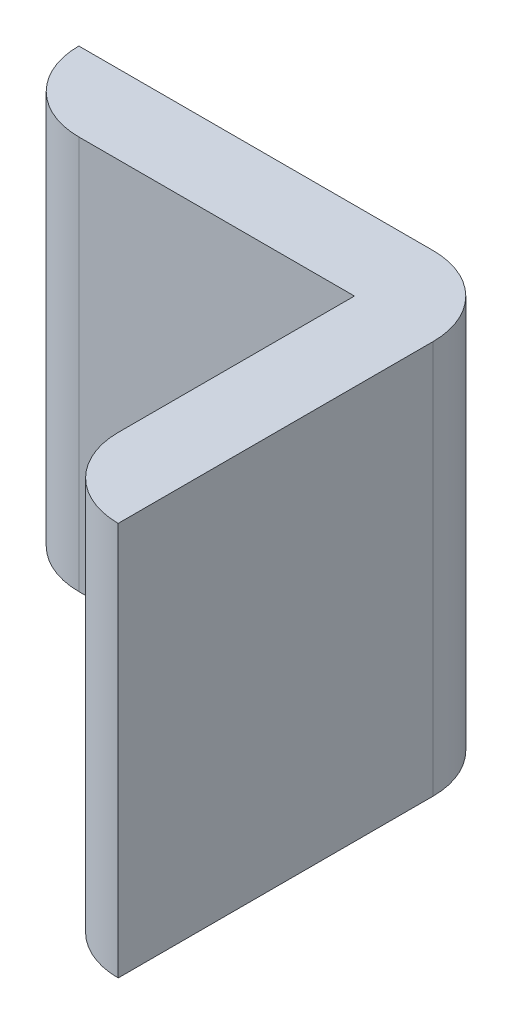
ISO-10303-21;
HEADER;
FILE_DESCRIPTION(('STEP AP214'),'2;1');
FILE_NAME('part.step','',(''),(''),'','','');
FILE_SCHEMA(('AUTOMOTIVE_DESIGN { 1 0 10303 214 1 1 1 1 }'));
ENDSEC;
DATA;
#1=APPLICATION_CONTEXT('core data for automotive mechanical design processes');
#2=APPLICATION_PROTOCOL_DEFINITION('international standard','automotive_design',2000,#1);
#3=PRODUCT_CONTEXT('',#1,'mechanical');
#4=PRODUCT('Part','Part','',(#3));
#5=PRODUCT_RELATED_PRODUCT_CATEGORY('part','',(#4));
#6=PRODUCT_DEFINITION_FORMATION('','',#4);
#7=PRODUCT_DEFINITION_CONTEXT('part definition',#1,'design');
#8=PRODUCT_DEFINITION('design','',#6,#7);
#9=PRODUCT_DEFINITION_SHAPE('','',#8);
#10=(LENGTH_UNIT() NAMED_UNIT(*) SI_UNIT(.MILLI.,.METRE.));
#11=(NAMED_UNIT(*) PLANE_ANGLE_UNIT() SI_UNIT($,.RADIAN.));
#12=(NAMED_UNIT(*) SI_UNIT($,.STERADIAN.) SOLID_ANGLE_UNIT());
#13=UNCERTAINTY_MEASURE_WITH_UNIT(LENGTH_MEASURE(1.E-05),#10,'distance_accuracy_value','');
#14=(GEOMETRIC_REPRESENTATION_CONTEXT(3) GLOBAL_UNCERTAINTY_ASSIGNED_CONTEXT((#13)) GLOBAL_UNIT_ASSIGNED_CONTEXT((#10,
#11,#12)) REPRESENTATION_CONTEXT('',''));
#15=CARTESIAN_POINT('',(0.,0.,0.));
#16=DIRECTION('',(0.,0.,1.));
#17=DIRECTION('',(1.,0.,0.));
#18=AXIS2_PLACEMENT_3D('',#15,#16,#17);
#19=CARTESIAN_POINT('',(0.381,-0.1905,0.381));
#20=DIRECTION('',(-1.,0.,0.));
#21=DIRECTION('',(0.,0.,1.));
#22=AXIS2_PLACEMENT_3D('',#19,#20,#21);
#23=PLANE('',#22);
#24=DIRECTION('',(0.,0.,-1.));
#25=VECTOR('',#24,1.);
#26=CARTESIAN_POINT('',(0.381,-0.1905,0.));
#27=LINE('',#26,#25);
#28=CARTESIAN_POINT('',(0.381,-0.1905,0.0762));
#29=VERTEX_POINT('',#28);
#30=CARTESIAN_POINT('',(0.381,-0.1905,0.381));
#31=VERTEX_POINT('',#30);
#32=EDGE_CURVE('E129',#29,#31,#27,.F.);
#33=ORIENTED_EDGE('',*,*,#32,.F.);
#34=DIRECTION('',(0.,-1.,0.));
#35=VECTOR('',#34,1.);
#36=CARTESIAN_POINT('',(0.381,-0.1905,0.0762));
#37=LINE('',#36,#35);
#38=CARTESIAN_POINT('',(0.381,0.1905,0.0762));
#39=VERTEX_POINT('',#38);
#40=EDGE_CURVE('E82',#39,#29,#37,.T.);
#41=ORIENTED_EDGE('',*,*,#40,.F.);
#42=DIRECTION('',(0.,0.,-1.));
#43=VECTOR('',#42,1.);
#44=CARTESIAN_POINT('',(0.381,0.1905,0.));
#45=LINE('',#44,#43);
#46=CARTESIAN_POINT('',(0.381,0.1905,0.381));
#47=VERTEX_POINT('',#46);
#48=EDGE_CURVE('E77',#39,#47,#45,.F.);
#49=ORIENTED_EDGE('',*,*,#48,.T.);
#50=DIRECTION('',(0.,-1.,0.));
#51=VECTOR('',#50,1.);
#52=CARTESIAN_POINT('',(0.381,-0.1905,0.381));
#53=LINE('',#52,#51);
#54=EDGE_CURVE('E123',#31,#47,#53,.F.);
#55=ORIENTED_EDGE('',*,*,#54,.F.);
#56=EDGE_LOOP('',(#33,#41,#49,#55));
#57=FACE_BOUND('',#56,.T.);
#58=ADVANCED_FACE('F17',(#57),#23,.F.);
#59=CARTESIAN_POINT('',(0.381,-0.1905,0.3048));
#60=DIRECTION('',(0.,-1.,0.));
#61=DIRECTION('',(0.,0.,-1.));
#62=AXIS2_PLACEMENT_3D('',#59,#60,#61);
#63=CYLINDRICAL_SURFACE('',#62,0.0762);
#64=CARTESIAN_POINT('',(0.381,0.1905,0.3048));
#65=DIRECTION('',(0.,-1.,0.));
#66=DIRECTION('',(0.,0.,-1.));
#67=AXIS2_PLACEMENT_3D('',#64,#65,#66);
#68=CIRCLE('',#67,0.0762);
#69=CARTESIAN_POINT('',(0.3048,0.1905,0.3048));
#70=VERTEX_POINT('',#69);
#71=EDGE_CURVE('E107',#47,#70,#68,.T.);
#72=ORIENTED_EDGE('',*,*,#71,.T.);
#73=DIRECTION('',(0.,1.,0.));
#74=VECTOR('',#73,1.);
#75=CARTESIAN_POINT('',(0.3048,-0.1905,0.3048));
#76=LINE('',#75,#74);
#77=CARTESIAN_POINT('',(0.3048,-0.1905,0.3048));
#78=VERTEX_POINT('',#77);
#79=EDGE_CURVE('E118',#70,#78,#76,.F.);
#80=ORIENTED_EDGE('',*,*,#79,.T.);
#81=CARTESIAN_POINT('',(0.381,-0.1905,0.3048));
#82=DIRECTION('',(0.,-1.,0.));
#83=DIRECTION('',(0.,0.,-1.));
#84=AXIS2_PLACEMENT_3D('',#81,#82,#83);
#85=CIRCLE('',#84,0.0762);
#86=EDGE_CURVE('E126',#31,#78,#85,.T.);
#87=ORIENTED_EDGE('',*,*,#86,.F.);
#88=ORIENTED_EDGE('',*,*,#54,.T.);
#89=EDGE_LOOP('',(#72,#80,#87,#88));
#90=FACE_BOUND('',#89,.T.);
#91=ADVANCED_FACE('F133',(#90),#63,.T.);
#92=CARTESIAN_POINT('',(0.3048,-0.1905,0.0762));
#93=DIRECTION('',(1.,0.,0.));
#94=DIRECTION('',(0.,0.,-1.));
#95=AXIS2_PLACEMENT_3D('',#92,#93,#94);
#96=PLANE('',#95);
#97=ORIENTED_EDGE('',*,*,#79,.F.);
#98=DIRECTION('',(0.,0.,-1.));
#99=VECTOR('',#98,1.);
#100=CARTESIAN_POINT('',(0.3048,0.1905,0.));
#101=LINE('',#100,#99);
#102=CARTESIAN_POINT('',(0.3048,0.1905,0.0762));
#103=VERTEX_POINT('',#102);
#104=EDGE_CURVE('E102',#70,#103,#101,.T.);
#105=ORIENTED_EDGE('',*,*,#104,.T.);
#106=DIRECTION('',(0.,1.,0.));
#107=VECTOR('',#106,1.);
#108=CARTESIAN_POINT('',(0.3048,-0.1905,0.0762));
#109=LINE('',#108,#107);
#110=CARTESIAN_POINT('',(0.3048,-0.1905,0.0762));
#111=VERTEX_POINT('',#110);
#112=EDGE_CURVE('E115',#103,#111,#109,.F.);
#113=ORIENTED_EDGE('',*,*,#112,.T.);
#114=DIRECTION('',(0.,0.,-1.));
#115=VECTOR('',#114,1.);
#116=CARTESIAN_POINT('',(0.3048,-0.1905,0.));
#117=LINE('',#116,#115);
#118=EDGE_CURVE('E128',#78,#111,#117,.T.);
#119=ORIENTED_EDGE('',*,*,#118,.F.);
#120=EDGE_LOOP('',(#97,#105,#113,#119));
#121=FACE_BOUND('',#120,.T.);
#122=ADVANCED_FACE('F158',(#121),#96,.F.);
#123=CARTESIAN_POINT('',(0.0381,-0.1905,0.0762));
#124=DIRECTION('',(0.,0.,-1.));
#125=DIRECTION('',(-1.,0.,0.));
#126=AXIS2_PLACEMENT_3D('',#123,#124,#125);
#127=PLANE('',#126);
#128=ORIENTED_EDGE('',*,*,#112,.F.);
#129=DIRECTION('',(1.,0.,0.));
#130=VECTOR('',#129,1.);
#131=CARTESIAN_POINT('',(-0.0381,0.1905,0.0762));
#132=LINE('',#131,#130);
#133=CARTESIAN_POINT('',(0.0381,0.1905,0.0762));
#134=VERTEX_POINT('',#133);
#135=EDGE_CURVE('E98',#103,#134,#132,.F.);
#136=ORIENTED_EDGE('',*,*,#135,.T.);
#137=DIRECTION('',(0.,-1.,0.));
#138=VECTOR('',#137,1.);
#139=CARTESIAN_POINT('',(0.0381,-0.1905,0.0762));
#140=LINE('',#139,#138);
#141=CARTESIAN_POINT('',(0.0381,-0.1905,0.0762));
#142=VERTEX_POINT('',#141);
#143=EDGE_CURVE('E101',#142,#134,#140,.F.);
#144=ORIENTED_EDGE('',*,*,#143,.F.);
#145=DIRECTION('',(1.,0.,0.));
#146=VECTOR('',#145,1.);
#147=CARTESIAN_POINT('',(-0.0381,-0.1905,0.0762));
#148=LINE('',#147,#146);
#149=EDGE_CURVE('E94',#111,#142,#148,.F.);
#150=ORIENTED_EDGE('',*,*,#149,.F.);
#151=EDGE_LOOP('',(#128,#136,#144,#150));
#152=FACE_BOUND('',#151,.T.);
#153=ADVANCED_FACE('F156',(#152),#127,.F.);
#154=CARTESIAN_POINT('',(0.3048,-0.1905,0.0762));
#155=DIRECTION('',(0.,-1.,0.));
#156=DIRECTION('',(0.,0.,-1.));
#157=AXIS2_PLACEMENT_3D('',#154,#155,#156);
#158=CYLINDRICAL_SURFACE('',#157,0.0762);
#159=CARTESIAN_POINT('',(0.3048,0.1905,0.0762));
#160=DIRECTION('',(0.,-1.,0.));
#161=DIRECTION('',(0.,0.,-1.));
#162=AXIS2_PLACEMENT_3D('',#159,#160,#161);
#163=CIRCLE('',#162,0.0762);
#164=CARTESIAN_POINT('',(0.3048,0.1905,0.));
#165=VERTEX_POINT('',#164);
#166=EDGE_CURVE('E20',#165,#39,#163,.T.);
#167=ORIENTED_EDGE('',*,*,#166,.T.);
#168=ORIENTED_EDGE('',*,*,#40,.T.);
#169=CARTESIAN_POINT('',(0.3048,-0.1905,0.0762));
#170=DIRECTION('',(0.,-1.,0.));
#171=DIRECTION('',(0.,0.,-1.));
#172=AXIS2_PLACEMENT_3D('',#169,#170,#171);
#173=CIRCLE('',#172,0.0762);
#174=CARTESIAN_POINT('',(0.3048,-0.1905,0.));
#175=VERTEX_POINT('',#174);
#176=EDGE_CURVE('E92',#175,#29,#173,.T.);
#177=ORIENTED_EDGE('',*,*,#176,.F.);
#178=DIRECTION('',(0.,1.,0.));
#179=VECTOR('',#178,1.);
#180=CARTESIAN_POINT('',(0.3048,-0.1905,0.));
#181=LINE('',#180,#179);
#182=EDGE_CURVE('E86',#175,#165,#181,.T.);
#183=ORIENTED_EDGE('',*,*,#182,.T.);
#184=EDGE_LOOP('',(#167,#168,#177,#183));
#185=FACE_BOUND('',#184,.T.);
#186=ADVANCED_FACE('F90',(#185),#158,.T.);
#187=CARTESIAN_POINT('',(-0.0381,0.1905,0.));
#188=DIRECTION('',(0.,-1.,0.));
#189=DIRECTION('',(0.,0.,-1.));
#190=AXIS2_PLACEMENT_3D('',#187,#188,#189);
#191=PLANE('',#190);
#192=ORIENTED_EDGE('',*,*,#135,.F.);
#193=ORIENTED_EDGE('',*,*,#104,.F.);
#194=ORIENTED_EDGE('',*,*,#71,.F.);
#195=ORIENTED_EDGE('',*,*,#48,.F.);
#196=ORIENTED_EDGE('',*,*,#166,.F.);
#197=DIRECTION('',(1.,0.,0.));
#198=VECTOR('',#197,1.);
#199=CARTESIAN_POINT('',(0.3048,0.1905,0.));
#200=LINE('',#199,#198);
#201=CARTESIAN_POINT('',(-0.0381,0.1905,0.));
#202=VERTEX_POINT('',#201);
#203=EDGE_CURVE('E74',#165,#202,#200,.F.);
#204=ORIENTED_EDGE('',*,*,#203,.T.);
#205=CARTESIAN_POINT('',(0.0381,0.1905,0.));
#206=DIRECTION('',(0.,-1.,0.));
#207=DIRECTION('',(0.,0.,-1.));
#208=AXIS2_PLACEMENT_3D('',#205,#206,#207);
#209=CIRCLE('',#208,0.0762);
#210=EDGE_CURVE('E114',#134,#202,#209,.T.);
#211=ORIENTED_EDGE('',*,*,#210,.F.);
#212=EDGE_LOOP('',(#192,#193,#194,#195,#196,#204,#211));
#213=FACE_BOUND('',#212,.T.);
#214=ADVANCED_FACE('F72',(#213),#191,.F.);
#215=CARTESIAN_POINT('',(0.0381,-0.1905,0.));
#216=DIRECTION('',(0.,-1.,0.));
#217=DIRECTION('',(0.,0.,-1.));
#218=AXIS2_PLACEMENT_3D('',#215,#216,#217);
#219=CYLINDRICAL_SURFACE('',#218,0.0762);
#220=ORIENTED_EDGE('',*,*,#210,.T.);
#221=DIRECTION('',(0.,1.,0.));
#222=VECTOR('',#221,1.);
#223=CARTESIAN_POINT('',(-0.0381,-0.1905,0.));
#224=LINE('',#223,#222);
#225=CARTESIAN_POINT('',(-0.0381,-0.1905,0.));
#226=VERTEX_POINT('',#225);
#227=EDGE_CURVE('E26',#202,#226,#224,.F.);
#228=ORIENTED_EDGE('',*,*,#227,.T.);
#229=CARTESIAN_POINT('',(0.0381,-0.1905,0.));
#230=DIRECTION('',(0.,-1.,0.));
#231=DIRECTION('',(0.,0.,-1.));
#232=AXIS2_PLACEMENT_3D('',#229,#230,#231);
#233=CIRCLE('',#232,0.0762);
#234=EDGE_CURVE('E34',#142,#226,#233,.T.);
#235=ORIENTED_EDGE('',*,*,#234,.F.);
#236=ORIENTED_EDGE('',*,*,#143,.T.);
#237=EDGE_LOOP('',(#220,#228,#235,#236));
#238=FACE_BOUND('',#237,.T.);
#239=ADVANCED_FACE('F141',(#238),#219,.T.);
#240=CARTESIAN_POINT('',(-0.0381,-0.1905,0.));
#241=DIRECTION('',(0.,-1.,0.));
#242=DIRECTION('',(0.,0.,-1.));
#243=AXIS2_PLACEMENT_3D('',#240,#241,#242);
#244=PLANE('',#243);
#245=ORIENTED_EDGE('',*,*,#149,.T.);
#246=ORIENTED_EDGE('',*,*,#234,.T.);
#247=DIRECTION('',(1.,0.,0.));
#248=VECTOR('',#247,1.);
#249=CARTESIAN_POINT('',(0.3048,-0.1905,0.));
#250=LINE('',#249,#248);
#251=EDGE_CURVE('E11',#226,#175,#250,.T.);
#252=ORIENTED_EDGE('',*,*,#251,.T.);
#253=ORIENTED_EDGE('',*,*,#176,.T.);
#254=ORIENTED_EDGE('',*,*,#32,.T.);
#255=ORIENTED_EDGE('',*,*,#86,.T.);
#256=ORIENTED_EDGE('',*,*,#118,.T.);
#257=EDGE_LOOP('',(#245,#246,#252,#253,#254,#255,#256));
#258=FACE_BOUND('',#257,.T.);
#259=ADVANCED_FACE('F139',(#258),#244,.T.);
#260=CARTESIAN_POINT('',(0.3048,-0.1905,0.));
#261=DIRECTION('',(0.,0.,1.));
#262=DIRECTION('',(1.,0.,0.));
#263=AXIS2_PLACEMENT_3D('',#260,#261,#262);
#264=PLANE('',#263);
#265=ORIENTED_EDGE('',*,*,#227,.F.);
#266=ORIENTED_EDGE('',*,*,#203,.F.);
#267=ORIENTED_EDGE('',*,*,#182,.F.);
#268=ORIENTED_EDGE('',*,*,#251,.F.);
#269=EDGE_LOOP('',(#265,#266,#267,#268));
#270=FACE_BOUND('',#269,.T.);
#271=ADVANCED_FACE('F85',(#270),#264,.F.);
#272=CLOSED_SHELL('',(#58,#91,#122,#153,#186,#214,#239,#259,#271));
#273=MANIFOLD_SOLID_BREP('B1',#272);
#274=ADVANCED_BREP_SHAPE_REPRESENTATION('',(#18,#273),#14);
#275=SHAPE_DEFINITION_REPRESENTATION(#9,#274);
ENDSEC;
END-ISO-10303-21;
